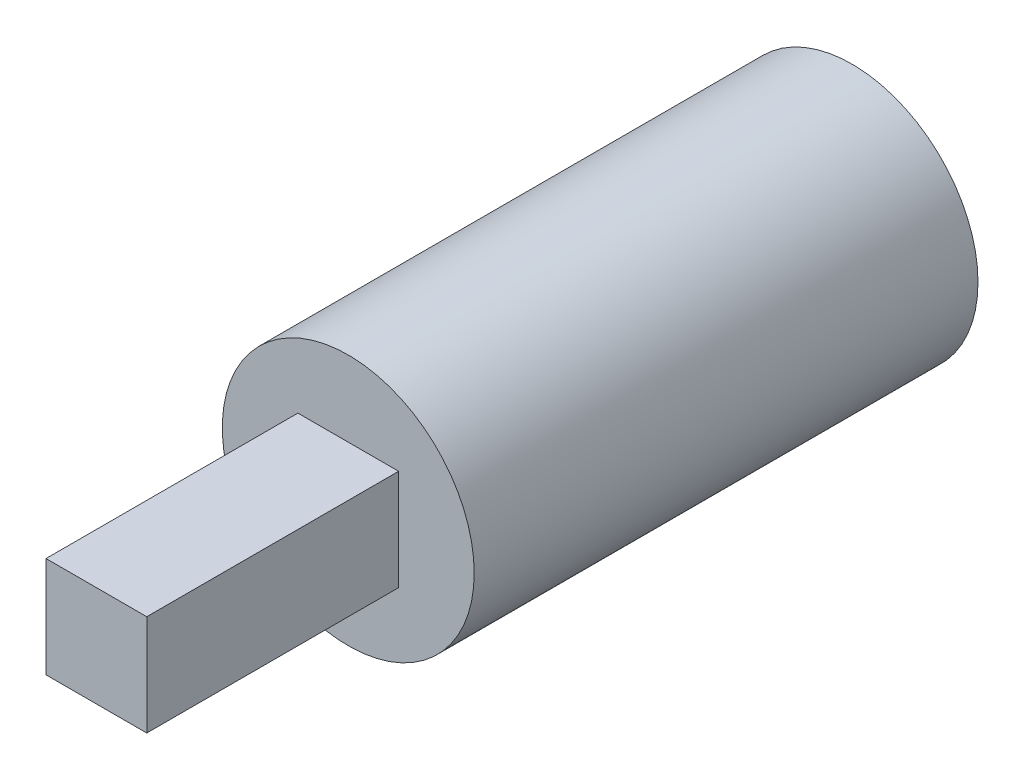
ISO-10303-21;
HEADER;
FILE_DESCRIPTION(('STEP AP214'),'2;1');
FILE_NAME('part.step','',(''),(''),'','','');
FILE_SCHEMA(('AUTOMOTIVE_DESIGN { 1 0 10303 214 1 1 1 1 }'));
ENDSEC;
DATA;
#1=APPLICATION_CONTEXT('core data for automotive mechanical design processes');
#2=APPLICATION_PROTOCOL_DEFINITION('international standard','automotive_design',2000,#1);
#3=PRODUCT_CONTEXT('',#1,'mechanical');
#4=PRODUCT('Part','Part','',(#3));
#5=PRODUCT_RELATED_PRODUCT_CATEGORY('part','',(#4));
#6=PRODUCT_DEFINITION_FORMATION('','',#4);
#7=PRODUCT_DEFINITION_CONTEXT('part definition',#1,'design');
#8=PRODUCT_DEFINITION('design','',#6,#7);
#9=PRODUCT_DEFINITION_SHAPE('','',#8);
#10=(LENGTH_UNIT() NAMED_UNIT(*) SI_UNIT(.MILLI.,.METRE.));
#11=(NAMED_UNIT(*) PLANE_ANGLE_UNIT() SI_UNIT($,.RADIAN.));
#12=(NAMED_UNIT(*) SI_UNIT($,.STERADIAN.) SOLID_ANGLE_UNIT());
#13=UNCERTAINTY_MEASURE_WITH_UNIT(LENGTH_MEASURE(1.E-05),#10,'distance_accuracy_value','');
#14=(GEOMETRIC_REPRESENTATION_CONTEXT(3) GLOBAL_UNCERTAINTY_ASSIGNED_CONTEXT((#13)) GLOBAL_UNIT_ASSIGNED_CONTEXT((#10,
#11,#12)) REPRESENTATION_CONTEXT('',''));
#15=CARTESIAN_POINT('',(0.,0.,0.));
#16=DIRECTION('',(0.,0.,1.));
#17=DIRECTION('',(1.,0.,0.));
#18=AXIS2_PLACEMENT_3D('',#15,#16,#17);
#19=CARTESIAN_POINT('',(0.,0.,10.));
#20=DIRECTION('',(0.,0.,-1.));
#21=DIRECTION('',(-1.,0.,0.));
#22=AXIS2_PLACEMENT_3D('',#19,#20,#21);
#23=CYLINDRICAL_SURFACE('',#22,2.5);
#24=CARTESIAN_POINT('',(0.,0.,10.));
#25=DIRECTION('',(0.,0.,1.));
#26=DIRECTION('',(1.,0.,0.));
#27=AXIS2_PLACEMENT_3D('',#24,#25,#26);
#28=CIRCLE('',#27,2.5);
#29=CARTESIAN_POINT('',(2.5,0.,10.));
#30=VERTEX_POINT('',#29);
#31=EDGE_CURVE('E11',#30,#30,#28,.T.);
#32=ORIENTED_EDGE('',*,*,#31,.F.);
#33=EDGE_LOOP('',(#32));
#34=FACE_BOUND('',#33,.T.);
#35=CARTESIAN_POINT('',(0.,0.,0.));
#36=DIRECTION('',(0.,0.,1.));
#37=DIRECTION('',(1.,0.,0.));
#38=AXIS2_PLACEMENT_3D('',#35,#36,#37);
#39=CIRCLE('',#38,2.5);
#40=CARTESIAN_POINT('',(2.5,0.,0.));
#41=VERTEX_POINT('',#40);
#42=EDGE_CURVE('E46',#41,#41,#39,.T.);
#43=ORIENTED_EDGE('',*,*,#42,.T.);
#44=EDGE_LOOP('',(#43));
#45=FACE_BOUND('',#44,.T.);
#46=ADVANCED_FACE('F43',(#34,#45),#23,.T.);
#47=CARTESIAN_POINT('',(0.,0.,10.));
#48=DIRECTION('',(0.,0.,1.));
#49=DIRECTION('',(1.,0.,0.));
#50=AXIS2_PLACEMENT_3D('',#47,#48,#49);
#51=PLANE('',#50);
#52=DIRECTION('',(0.,1.,0.));
#53=VECTOR('',#52,1.);
#54=CARTESIAN_POINT('',(1.,-1.,10.));
#55=LINE('',#54,#53);
#56=CARTESIAN_POINT('',(1.,-1.,10.));
#57=VERTEX_POINT('',#56);
#58=CARTESIAN_POINT('',(1.,1.,10.));
#59=VERTEX_POINT('',#58);
#60=EDGE_CURVE('E58',#57,#59,#55,.T.);
#61=ORIENTED_EDGE('',*,*,#60,.F.);
#62=DIRECTION('',(1.,0.,0.));
#63=VECTOR('',#62,1.);
#64=CARTESIAN_POINT('',(-1.,-1.,10.));
#65=LINE('',#64,#63);
#66=CARTESIAN_POINT('',(-1.,-1.,10.));
#67=VERTEX_POINT('',#66);
#68=EDGE_CURVE('E62',#67,#57,#65,.T.);
#69=ORIENTED_EDGE('',*,*,#68,.F.);
#70=DIRECTION('',(0.,-1.,0.));
#71=VECTOR('',#70,1.);
#72=CARTESIAN_POINT('',(-1.,-1.,10.));
#73=LINE('',#72,#71);
#74=CARTESIAN_POINT('',(-1.,1.,10.));
#75=VERTEX_POINT('',#74);
#76=EDGE_CURVE('E122',#75,#67,#73,.T.);
#77=ORIENTED_EDGE('',*,*,#76,.F.);
#78=DIRECTION('',(-1.,0.,0.));
#79=VECTOR('',#78,1.);
#80=CARTESIAN_POINT('',(-1.,1.,10.));
#81=LINE('',#80,#79);
#82=EDGE_CURVE('E125',#59,#75,#81,.T.);
#83=ORIENTED_EDGE('',*,*,#82,.F.);
#84=EDGE_LOOP('',(#61,#69,#77,#83));
#85=FACE_BOUND('',#84,.T.);
#86=ORIENTED_EDGE('',*,*,#31,.T.);
#87=EDGE_LOOP('',(#86));
#88=FACE_BOUND('',#87,.T.);
#89=ADVANCED_FACE('F147',(#85,#88),#51,.T.);
#90=CARTESIAN_POINT('',(0.,0.,0.));
#91=DIRECTION('',(0.,0.,1.));
#92=DIRECTION('',(1.,0.,0.));
#93=AXIS2_PLACEMENT_3D('',#90,#91,#92);
#94=PLANE('',#93);
#95=ORIENTED_EDGE('',*,*,#42,.F.);
#96=EDGE_LOOP('',(#95));
#97=FACE_BOUND('',#96,.T.);
#98=ADVANCED_FACE('F153',(#97),#94,.F.);
#99=CARTESIAN_POINT('',(1.,-1.,15.));
#100=DIRECTION('',(-1.,0.,0.));
#101=DIRECTION('',(0.,-1.,0.));
#102=AXIS2_PLACEMENT_3D('',#99,#100,#101);
#103=PLANE('',#102);
#104=ORIENTED_EDGE('',*,*,#60,.T.);
#105=DIRECTION('',(0.,0.,-1.));
#106=VECTOR('',#105,1.);
#107=CARTESIAN_POINT('',(1.,1.,15.));
#108=LINE('',#107,#106);
#109=CARTESIAN_POINT('',(1.,1.,15.));
#110=VERTEX_POINT('',#109);
#111=EDGE_CURVE('E87',#110,#59,#108,.T.);
#112=ORIENTED_EDGE('',*,*,#111,.F.);
#113=DIRECTION('',(0.,1.,0.));
#114=VECTOR('',#113,1.);
#115=CARTESIAN_POINT('',(1.,-1.,15.));
#116=LINE('',#115,#114);
#117=CARTESIAN_POINT('',(1.,-1.,15.));
#118=VERTEX_POINT('',#117);
#119=EDGE_CURVE('E94',#118,#110,#116,.T.);
#120=ORIENTED_EDGE('',*,*,#119,.F.);
#121=DIRECTION('',(0.,0.,-1.));
#122=VECTOR('',#121,1.);
#123=CARTESIAN_POINT('',(1.,-1.,15.));
#124=LINE('',#123,#122);
#125=EDGE_CURVE('E117',#118,#57,#124,.T.);
#126=ORIENTED_EDGE('',*,*,#125,.T.);
#127=EDGE_LOOP('',(#104,#112,#120,#126));
#128=FACE_BOUND('',#127,.T.);
#129=ADVANCED_FACE('F105',(#128),#103,.F.);
#130=CARTESIAN_POINT('',(-1.,1.,15.));
#131=DIRECTION('',(0.,-1.,0.));
#132=DIRECTION('',(1.,0.,0.));
#133=AXIS2_PLACEMENT_3D('',#130,#131,#132);
#134=PLANE('',#133);
#135=ORIENTED_EDGE('',*,*,#82,.T.);
#136=DIRECTION('',(0.,0.,-1.));
#137=VECTOR('',#136,1.);
#138=CARTESIAN_POINT('',(-1.,1.,15.));
#139=LINE('',#138,#137);
#140=CARTESIAN_POINT('',(-1.,1.,15.));
#141=VERTEX_POINT('',#140);
#142=EDGE_CURVE('E89',#141,#75,#139,.T.);
#143=ORIENTED_EDGE('',*,*,#142,.F.);
#144=DIRECTION('',(-1.,0.,0.));
#145=VECTOR('',#144,1.);
#146=CARTESIAN_POINT('',(-1.,1.,15.));
#147=LINE('',#146,#145);
#148=EDGE_CURVE('E82',#110,#141,#147,.T.);
#149=ORIENTED_EDGE('',*,*,#148,.F.);
#150=ORIENTED_EDGE('',*,*,#111,.T.);
#151=EDGE_LOOP('',(#135,#143,#149,#150));
#152=FACE_BOUND('',#151,.T.);
#153=ADVANCED_FACE('F85',(#152),#134,.F.);
#154=CARTESIAN_POINT('',(-1.,-1.,15.));
#155=DIRECTION('',(1.,0.,0.));
#156=DIRECTION('',(0.,1.,0.));
#157=AXIS2_PLACEMENT_3D('',#154,#155,#156);
#158=PLANE('',#157);
#159=ORIENTED_EDGE('',*,*,#76,.T.);
#160=DIRECTION('',(0.,0.,-1.));
#161=VECTOR('',#160,1.);
#162=CARTESIAN_POINT('',(-1.,-1.,15.));
#163=LINE('',#162,#161);
#164=CARTESIAN_POINT('',(-1.,-1.,15.));
#165=VERTEX_POINT('',#164);
#166=EDGE_CURVE('E111',#165,#67,#163,.T.);
#167=ORIENTED_EDGE('',*,*,#166,.F.);
#168=DIRECTION('',(0.,-1.,0.));
#169=VECTOR('',#168,1.);
#170=CARTESIAN_POINT('',(-1.,-1.,15.));
#171=LINE('',#170,#169);
#172=EDGE_CURVE('E93',#141,#165,#171,.T.);
#173=ORIENTED_EDGE('',*,*,#172,.F.);
#174=ORIENTED_EDGE('',*,*,#142,.T.);
#175=EDGE_LOOP('',(#159,#167,#173,#174));
#176=FACE_BOUND('',#175,.T.);
#177=ADVANCED_FACE('F135',(#176),#158,.F.);
#178=CARTESIAN_POINT('',(-1.,-1.,15.));
#179=DIRECTION('',(0.,1.,0.));
#180=DIRECTION('',(0.,0.,1.));
#181=AXIS2_PLACEMENT_3D('',#178,#179,#180);
#182=PLANE('',#181);
#183=ORIENTED_EDGE('',*,*,#68,.T.);
#184=ORIENTED_EDGE('',*,*,#125,.F.);
#185=DIRECTION('',(1.,0.,0.));
#186=VECTOR('',#185,1.);
#187=CARTESIAN_POINT('',(-1.,-1.,15.));
#188=LINE('',#187,#186);
#189=EDGE_CURVE('E99',#165,#118,#188,.T.);
#190=ORIENTED_EDGE('',*,*,#189,.F.);
#191=ORIENTED_EDGE('',*,*,#166,.T.);
#192=EDGE_LOOP('',(#183,#184,#190,#191));
#193=FACE_BOUND('',#192,.T.);
#194=ADVANCED_FACE('F137',(#193),#182,.F.);
#195=CARTESIAN_POINT('',(0.,0.,15.));
#196=DIRECTION('',(0.,0.,-1.));
#197=DIRECTION('',(-1.,0.,0.));
#198=AXIS2_PLACEMENT_3D('',#195,#196,#197);
#199=PLANE('',#198);
#200=ORIENTED_EDGE('',*,*,#119,.T.);
#201=ORIENTED_EDGE('',*,*,#148,.T.);
#202=ORIENTED_EDGE('',*,*,#172,.T.);
#203=ORIENTED_EDGE('',*,*,#189,.T.);
#204=EDGE_LOOP('',(#200,#201,#202,#203));
#205=FACE_BOUND('',#204,.T.);
#206=ADVANCED_FACE('F97',(#205),#199,.F.);
#207=CLOSED_SHELL('',(#46,#89,#98,#129,#153,#177,#194,#206));
#208=MANIFOLD_SOLID_BREP('B2',#207);
#209=ADVANCED_BREP_SHAPE_REPRESENTATION('',(#18,#208),#14);
#210=SHAPE_DEFINITION_REPRESENTATION(#9,#209);
ENDSEC;
END-ISO-10303-21;
